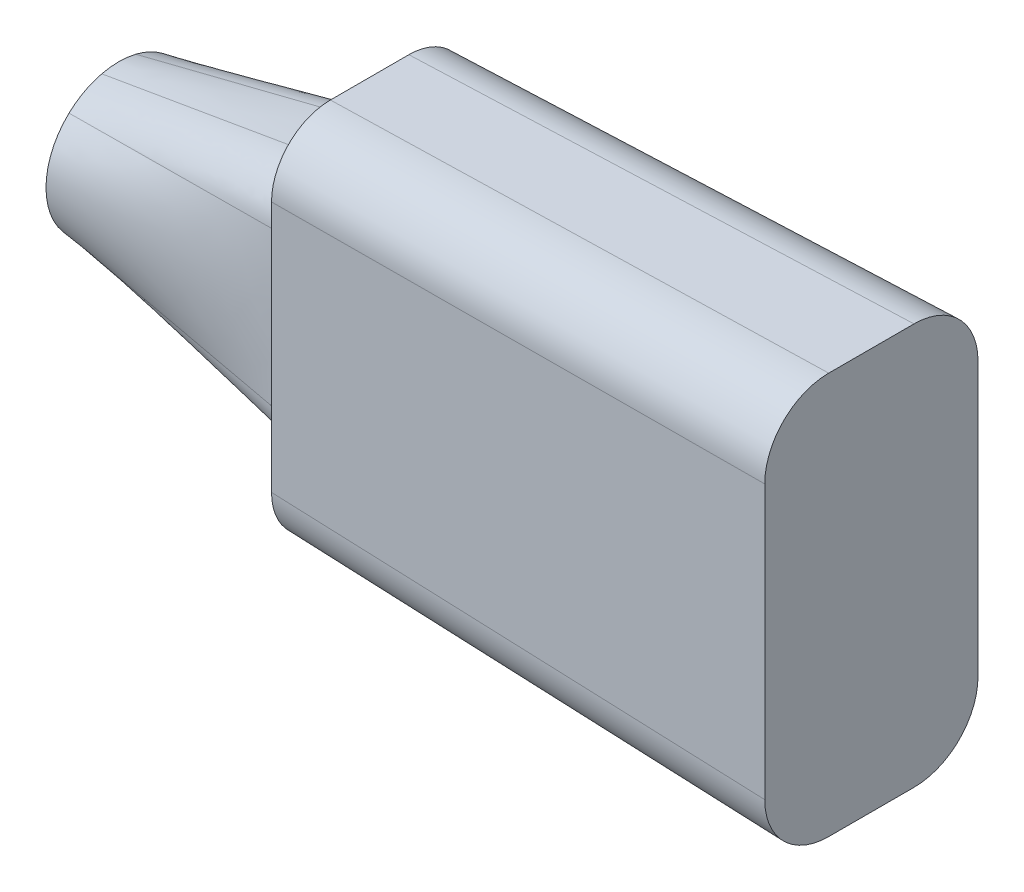
ISO-10303-21;
HEADER;
FILE_DESCRIPTION(('STEP AP214'),'2;1');
FILE_NAME('part.step','',(''),(''),'','','');
FILE_SCHEMA(('AUTOMOTIVE_DESIGN { 1 0 10303 214 1 1 1 1 }'));
ENDSEC;
DATA;
#1=APPLICATION_CONTEXT('core data for automotive mechanical design processes');
#2=APPLICATION_PROTOCOL_DEFINITION('international standard','automotive_design',2000,#1);
#3=PRODUCT_CONTEXT('',#1,'mechanical');
#4=PRODUCT('Part','Part','',(#3));
#5=PRODUCT_RELATED_PRODUCT_CATEGORY('part','',(#4));
#6=PRODUCT_DEFINITION_FORMATION('','',#4);
#7=PRODUCT_DEFINITION_CONTEXT('part definition',#1,'design');
#8=PRODUCT_DEFINITION('design','',#6,#7);
#9=PRODUCT_DEFINITION_SHAPE('','',#8);
#10=(LENGTH_UNIT() NAMED_UNIT(*) SI_UNIT(.MILLI.,.METRE.));
#11=(NAMED_UNIT(*) PLANE_ANGLE_UNIT() SI_UNIT($,.RADIAN.));
#12=(NAMED_UNIT(*) SI_UNIT($,.STERADIAN.) SOLID_ANGLE_UNIT());
#13=UNCERTAINTY_MEASURE_WITH_UNIT(LENGTH_MEASURE(1.E-05),#10,'distance_accuracy_value','');
#14=(GEOMETRIC_REPRESENTATION_CONTEXT(3) GLOBAL_UNCERTAINTY_ASSIGNED_CONTEXT((#13)) GLOBAL_UNIT_ASSIGNED_CONTEXT((#10,
#11,#12)) REPRESENTATION_CONTEXT('',''));
#15=CARTESIAN_POINT('',(0.,0.,0.));
#16=DIRECTION('',(0.,0.,1.));
#17=DIRECTION('',(1.,0.,0.));
#18=AXIS2_PLACEMENT_3D('',#15,#16,#17);
#19=CARTESIAN_POINT('',(-156.,32.,199.5));
#20=DIRECTION('',(-1.,0.,0.));
#21=DIRECTION('',(0.,0.,1.));
#22=AXIS2_PLACEMENT_3D('',#19,#20,#21);
#23=PLANE('',#22);
#24=CARTESIAN_POINT('',(-156.,32.,199.5));
#25=DIRECTION('',(-1.,0.,0.));
#26=DIRECTION('',(0.,-1.,0.));
#27=AXIS2_PLACEMENT_3D('',#24,#25,#26);
#28=CIRCLE('',#27,2.9);
#29=CARTESIAN_POINT('',(-156.,34.819974775106,200.1765665287));
#30=VERTEX_POINT('',#29);
#31=CARTESIAN_POINT('',(-156.,34.819974775106,198.82343347129));
#32=VERTEX_POINT('',#31);
#33=EDGE_CURVE('E10',#30,#32,#28,.T.);
#34=ORIENTED_EDGE('',*,*,#33,.T.);
#35=CARTESIAN_POINT('',(-156.,32.,199.5));
#36=DIRECTION('',(-1.,0.,0.));
#37=DIRECTION('',(0.,-1.,0.));
#38=AXIS2_PLACEMENT_3D('',#35,#36,#37);
#39=CIRCLE('',#38,2.9);
#40=CARTESIAN_POINT('',(-156.,34.116177449792,197.51712506673));
#41=VERTEX_POINT('',#40);
#42=EDGE_CURVE('E222',#32,#41,#39,.T.);
#43=ORIENTED_EDGE('',*,*,#42,.T.);
#44=CARTESIAN_POINT('',(-156.,32.,199.5));
#45=DIRECTION('',(-1.,0.,0.));
#46=DIRECTION('',(0.,-1.,0.));
#47=AXIS2_PLACEMENT_3D('',#44,#45,#46);
#48=CIRCLE('',#47,2.9);
#49=CARTESIAN_POINT('',(-156.,29.883822550208,197.51712506673));
#50=VERTEX_POINT('',#49);
#51=EDGE_CURVE('E320',#41,#50,#48,.T.);
#52=ORIENTED_EDGE('',*,*,#51,.T.);
#53=CARTESIAN_POINT('',(-156.,32.,199.5));
#54=DIRECTION('',(-1.,0.,0.));
#55=DIRECTION('',(0.,-1.,0.));
#56=AXIS2_PLACEMENT_3D('',#53,#54,#55);
#57=CIRCLE('',#56,2.9);
#58=CARTESIAN_POINT('',(-156.,29.180025224894,198.82343347129));
#59=VERTEX_POINT('',#58);
#60=EDGE_CURVE('E319',#50,#59,#57,.T.);
#61=ORIENTED_EDGE('',*,*,#60,.T.);
#62=CARTESIAN_POINT('',(-156.,32.,199.5));
#63=DIRECTION('',(-1.,0.,0.));
#64=DIRECTION('',(0.,-1.,0.));
#65=AXIS2_PLACEMENT_3D('',#62,#63,#64);
#66=CIRCLE('',#65,2.9);
#67=CARTESIAN_POINT('',(-156.,29.1,199.5));
#68=VERTEX_POINT('',#67);
#69=EDGE_CURVE('E376',#59,#68,#66,.T.);
#70=ORIENTED_EDGE('',*,*,#69,.T.);
#71=CARTESIAN_POINT('',(-156.,32.,199.5));
#72=DIRECTION('',(-1.,0.,0.));
#73=DIRECTION('',(0.,-1.,0.));
#74=AXIS2_PLACEMENT_3D('',#71,#72,#73);
#75=CIRCLE('',#74,2.9);
#76=CARTESIAN_POINT('',(-156.,29.180025224894,200.1765665287));
#77=VERTEX_POINT('',#76);
#78=EDGE_CURVE('E336',#68,#77,#75,.T.);
#79=ORIENTED_EDGE('',*,*,#78,.T.);
#80=CARTESIAN_POINT('',(-156.,32.,199.5));
#81=DIRECTION('',(-1.,0.,0.));
#82=DIRECTION('',(0.,-1.,0.));
#83=AXIS2_PLACEMENT_3D('',#80,#81,#82);
#84=CIRCLE('',#83,2.9);
#85=CARTESIAN_POINT('',(-156.,29.883822550208,201.48287493327));
#86=VERTEX_POINT('',#85);
#87=EDGE_CURVE('E292',#77,#86,#84,.T.);
#88=ORIENTED_EDGE('',*,*,#87,.T.);
#89=CARTESIAN_POINT('',(-156.,32.,199.5));
#90=DIRECTION('',(-1.,0.,0.));
#91=DIRECTION('',(0.,-1.,0.));
#92=AXIS2_PLACEMENT_3D('',#89,#90,#91);
#93=CIRCLE('',#92,2.9);
#94=CARTESIAN_POINT('',(-156.,34.116177449792,201.48287493327));
#95=VERTEX_POINT('',#94);
#96=EDGE_CURVE('E231',#86,#95,#93,.T.);
#97=ORIENTED_EDGE('',*,*,#96,.T.);
#98=CARTESIAN_POINT('',(-156.,32.,199.5));
#99=DIRECTION('',(-1.,0.,0.));
#100=DIRECTION('',(0.,-1.,0.));
#101=AXIS2_PLACEMENT_3D('',#98,#99,#100);
#102=CIRCLE('',#101,2.9);
#103=EDGE_CURVE('E28',#95,#30,#102,.T.);
#104=ORIENTED_EDGE('',*,*,#103,.T.);
#105=EDGE_LOOP('',(#34,#43,#52,#61,#70,#79,#88,#97,#104));
#106=FACE_BOUND('',#105,.T.);
#107=ADVANCED_FACE('F15',(#106),#23,.T.);
#108=CARTESIAN_POINT('',(-146.,36.96,200.69));
#109=CARTESIAN_POINT('',(-156.,34.819974775106,200.1765665287));
#110=CARTESIAN_POINT('',(-146.,36.96,200.214));
#111=CARTESIAN_POINT('',(-156.,34.883698878625,199.91096018126));
#112=CARTESIAN_POINT('',(-146.,36.96,199.738));
#113=CARTESIAN_POINT('',(-156.,34.916152983537,199.63785134543));
#114=CARTESIAN_POINT('',(-146.,36.96,199.262));
#115=CARTESIAN_POINT('',(-156.,34.916152983537,199.36214865456));
#116=CARTESIAN_POINT('',(-146.,36.96,198.786));
#117=CARTESIAN_POINT('',(-156.,34.883698878625,199.08903981873));
#118=CARTESIAN_POINT('',(-146.,36.96,198.31));
#119=CARTESIAN_POINT('',(-156.,34.819974775106,198.82343347129));
#120=(BOUNDED_SURFACE() B_SPLINE_SURFACE(5,1,((#108,#109),(#110,#111),(#112,#113),(#114,#115),
(#116,#117),(#118,#119)),.UNSPECIFIED.,.F.,.F.,.F.) B_SPLINE_SURFACE_WITH_KNOTS((6,6),(2,2),
(-1.19,1.19),(0.,1.),
.UNSPECIFIED.) GEOMETRIC_REPRESENTATION_ITEM() RATIONAL_B_SPLINE_SURFACE(((1.,1.),(1.,1.),(1.,
1.),(1.,1.),(1.,1.),(1.,1.))) REPRESENTATION_ITEM('') SURFACE());
#121=DIRECTION('',(0.,0.,1.));
#122=VECTOR('',#121,1.);
#123=CARTESIAN_POINT('',(-146.,36.96,199.5));
#124=LINE('',#123,#122);
#125=CARTESIAN_POINT('',(-146.,36.96,198.31));
#126=VERTEX_POINT('',#125);
#127=CARTESIAN_POINT('',(-146.,36.96,200.69));
#128=VERTEX_POINT('',#127);
#129=EDGE_CURVE('E215',#126,#128,#124,.T.);
#130=CARTESIAN_POINT('',(-146.,36.96,198.31));
#131=CARTESIAN_POINT('',(-156.,34.819974775106,198.82343347129));
#132=(BOUNDED_CURVE() B_SPLINE_CURVE(1,(#130,#131),.UNSPECIFIED.,.F.,
.F.) B_SPLINE_CURVE_WITH_KNOTS((2,2),(0.,1.),
.UNSPECIFIED.) CURVE() GEOMETRIC_REPRESENTATION_ITEM() RATIONAL_B_SPLINE_CURVE((1.,1.)) REPRESENTATION_ITEM(''));
#133=EDGE_CURVE('E216',#126,#32,#132,.T.);
#134=CARTESIAN_POINT('',(-146.,36.96,200.69));
#135=CARTESIAN_POINT('',(-156.,34.819974775106,200.1765665287));
#136=(BOUNDED_CURVE() B_SPLINE_CURVE(1,(#134,#135),.UNSPECIFIED.,.F.,
.F.) B_SPLINE_CURVE_WITH_KNOTS((2,2),(0.,1.),
.UNSPECIFIED.) CURVE() GEOMETRIC_REPRESENTATION_ITEM() RATIONAL_B_SPLINE_CURVE((1.,1.)) REPRESENTATION_ITEM(''));
#137=EDGE_CURVE('E223',#128,#30,#136,.T.);
#138=ORIENTED_EDGE('',*,*,#129,.F.);
#139=ORIENTED_EDGE('',*,*,#133,.T.);
#140=ORIENTED_EDGE('',*,*,#33,.F.);
#141=ORIENTED_EDGE('',*,*,#137,.F.);
#142=EDGE_LOOP('',(#138,#139,#140,#141));
#143=FACE_BOUND('',#142,.T.);
#144=ADVANCED_FACE('F495',(#143),#120,.T.);
#145=CARTESIAN_POINT('',(-146.,35.175,202.475));
#146=CARTESIAN_POINT('',(-156.,34.116177449792,201.48287493327));
#147=CARTESIAN_POINT('',(-146.,35.525483930416,202.475));
#148=CARTESIAN_POINT('',(-156.,34.244424984266,201.3460057158));
#149=CARTESIAN_POINT('',(-146.,35.875967971155,202.3963514917));
#150=CARTESIAN_POINT('',(-156.,34.362555516395,201.19965681357));
#151=CARTESIAN_POINT('',(-145.9999999999,36.205861123288,202.23905524758));
#152=CARTESIAN_POINT('',(-156.,34.469751592824,201.04470060556));
#153=CARTESIAN_POINT('',(-146.,36.494576879067,202.00957687906));
#154=CARTESIAN_POINT('',(-156.,34.565285920333,200.88209427657));
#155=CARTESIAN_POINT('',(-145.9999999999,36.72405524758,201.72086112328));
#156=CARTESIAN_POINT('',(-156.,34.648532564804,200.71286773568));
#157=CARTESIAN_POINT('',(-146.,36.881351491704,201.39096797115));
#158=CARTESIAN_POINT('',(-156.,34.718975727028,200.53811022912));
#159=CARTESIAN_POINT('',(-146.,36.96,201.04048393041));
#160=CARTESIAN_POINT('',(-156.,34.776216095344,200.35895564771));
#161=CARTESIAN_POINT('',(-146.,36.96,200.69));
#162=CARTESIAN_POINT('',(-156.,34.819974775106,200.1765665287));
#163=(BOUNDED_SURFACE() B_SPLINE_SURFACE(8,1,((#145,#146),(#147,#148),(#149,#150),(#151,#152),
(#153,#154),(#155,#156),(#157,#158),(#159,#160),(#161,#162)),.UNSPECIFIED.,.F.,.F.,
.F.) B_SPLINE_SURFACE_WITH_KNOTS((9,9),(2,2),(1.570796326795,3.14159265359),(0.,1.),
.UNSPECIFIED.) GEOMETRIC_REPRESENTATION_ITEM() RATIONAL_B_SPLINE_SURFACE(((1.,1.),(1.,1.),(1.,
1.),(1.,1.),(1.,1.),(1.,1.),(1.,1.),(1.,1.),(1.,1.))) REPRESENTATION_ITEM('') SURFACE());
#164=CARTESIAN_POINT('',(-146.,35.175,200.69));
#165=DIRECTION('',(-1.,0.,0.));
#166=DIRECTION('',(0.,-1.,0.));
#167=AXIS2_PLACEMENT_3D('',#164,#165,#166);
#168=CIRCLE('',#167,1.785);
#169=CARTESIAN_POINT('',(-146.,35.175,202.475));
#170=VERTEX_POINT('',#169);
#171=EDGE_CURVE('E264',#170,#128,#168,.T.);
#172=CARTESIAN_POINT('',(-146.,35.175,202.475));
#173=CARTESIAN_POINT('',(-156.,34.116177449792,201.48287493327));
#174=(BOUNDED_CURVE() B_SPLINE_CURVE(1,(#172,#173),.UNSPECIFIED.,.F.,
.F.) B_SPLINE_CURVE_WITH_KNOTS((2,2),(0.,1.),
.UNSPECIFIED.) CURVE() GEOMETRIC_REPRESENTATION_ITEM() RATIONAL_B_SPLINE_CURVE((1.,1.)) REPRESENTATION_ITEM(''));
#175=EDGE_CURVE('E283',#170,#95,#174,.T.);
#176=ORIENTED_EDGE('',*,*,#171,.T.);
#177=ORIENTED_EDGE('',*,*,#137,.T.);
#178=ORIENTED_EDGE('',*,*,#103,.F.);
#179=ORIENTED_EDGE('',*,*,#175,.F.);
#180=EDGE_LOOP('',(#176,#177,#178,#179));
#181=FACE_BOUND('',#180,.T.);
#182=ADVANCED_FACE('F493',(#181),#163,.T.);
#183=CARTESIAN_POINT('',(-146.,28.825,202.475));
#184=CARTESIAN_POINT('',(-156.,29.883822550208,201.48287493327));
#185=CARTESIAN_POINT('',(-146.,29.61875,202.475));
#186=CARTESIAN_POINT('',(-156.,30.289274387923,201.91558403738));
#187=CARTESIAN_POINT('',(-146.,30.4125,202.475));
#188=CARTESIAN_POINT('',(-156.,30.795845375594,202.25354404544));
#189=CARTESIAN_POINT('',(-146.,31.20625,202.475));
#190=CARTESIAN_POINT('',(-156.,31.377700771839,202.46918615549));
#191=CARTESIAN_POINT('',(-146.,32.,202.475));
#192=CARTESIAN_POINT('',(-155.9999999999,32.,202.54339413558));
#193=CARTESIAN_POINT('',(-146.,32.79375,202.475));
#194=CARTESIAN_POINT('',(-156.,32.622299228161,202.46918615549));
#195=CARTESIAN_POINT('',(-146.,33.5875,202.475));
#196=CARTESIAN_POINT('',(-155.9999999999,33.204154624406,202.25354404544));
#197=CARTESIAN_POINT('',(-146.,34.38125,202.475));
#198=CARTESIAN_POINT('',(-156.,33.710725612077,201.91558403738));
#199=CARTESIAN_POINT('',(-146.,35.175,202.475));
#200=CARTESIAN_POINT('',(-156.,34.116177449792,201.48287493327));
#201=(BOUNDED_SURFACE() B_SPLINE_SURFACE(8,1,((#183,#184),(#185,#186),(#187,#188),(#189,#190),
(#191,#192),(#193,#194),(#195,#196),(#197,#198),(#199,#200)),.UNSPECIFIED.,.F.,.F.,
.F.) B_SPLINE_SURFACE_WITH_KNOTS((9,9),(2,2),(-3.175,3.175),(0.,1.),
.UNSPECIFIED.) GEOMETRIC_REPRESENTATION_ITEM() RATIONAL_B_SPLINE_SURFACE(((1.,1.),(1.,1.),(1.,
1.),(1.,1.),(1.,1.),(1.,1.),(1.,1.),(1.,1.),(1.,1.))) REPRESENTATION_ITEM('') SURFACE());
#202=DIRECTION('',(0.,-1.,0.));
#203=VECTOR('',#202,1.);
#204=CARTESIAN_POINT('',(-146.,32.,202.475));
#205=LINE('',#204,#203);
#206=CARTESIAN_POINT('',(-146.,28.825,202.475));
#207=VERTEX_POINT('',#206);
#208=EDGE_CURVE('E210',#170,#207,#205,.T.);
#209=CARTESIAN_POINT('',(-146.,28.825,202.475));
#210=CARTESIAN_POINT('',(-156.,29.883822550208,201.48287493327));
#211=(BOUNDED_CURVE() B_SPLINE_CURVE(1,(#209,#210),.UNSPECIFIED.,.F.,
.F.) B_SPLINE_CURVE_WITH_KNOTS((2,2),(0.,1.),
.UNSPECIFIED.) CURVE() GEOMETRIC_REPRESENTATION_ITEM() RATIONAL_B_SPLINE_CURVE((1.,1.)) REPRESENTATION_ITEM(''));
#212=EDGE_CURVE('E330',#207,#86,#211,.T.);
#213=ORIENTED_EDGE('',*,*,#208,.F.);
#214=ORIENTED_EDGE('',*,*,#175,.T.);
#215=ORIENTED_EDGE('',*,*,#96,.F.);
#216=ORIENTED_EDGE('',*,*,#212,.F.);
#217=EDGE_LOOP('',(#213,#214,#215,#216));
#218=FACE_BOUND('',#217,.T.);
#219=ADVANCED_FACE('F491',(#218),#201,.T.);
#220=CARTESIAN_POINT('',(-146.,27.04,200.69));
#221=CARTESIAN_POINT('',(-156.,29.180025224894,200.1765665287));
#222=CARTESIAN_POINT('',(-146.,27.04,201.04048393041));
#223=CARTESIAN_POINT('',(-156.,29.223783904656,200.35895564771));
#224=CARTESIAN_POINT('',(-146.,27.118648508296,201.39096797115));
#225=CARTESIAN_POINT('',(-156.,29.281024272972,200.53811022912));
#226=CARTESIAN_POINT('',(-146.,27.27594475242,201.72086112328));
#227=CARTESIAN_POINT('',(-156.,29.351467435196,200.71286773568));
#228=CARTESIAN_POINT('',(-145.9999999999,27.505423120933,202.00957687906));
#229=CARTESIAN_POINT('',(-156.,29.434714079667,200.88209427657));
#230=CARTESIAN_POINT('',(-146.,27.794138876712,202.23905524758));
#231=CARTESIAN_POINT('',(-156.,29.530248407176,201.04470060556));
#232=CARTESIAN_POINT('',(-146.,28.124032028845,202.3963514917));
#233=CARTESIAN_POINT('',(-156.,29.637444483605,201.19965681357));
#234=CARTESIAN_POINT('',(-146.,28.474516069584,202.475));
#235=CARTESIAN_POINT('',(-156.,29.755575015734,201.3460057158));
#236=CARTESIAN_POINT('',(-146.,28.825,202.475));
#237=CARTESIAN_POINT('',(-156.,29.883822550208,201.48287493327));
#238=(BOUNDED_SURFACE() B_SPLINE_SURFACE(8,1,((#220,#221),(#222,#223),(#224,#225),(#226,#227),
(#228,#229),(#230,#231),(#232,#233),(#234,#235),(#236,#237)),.UNSPECIFIED.,.F.,.F.,
.F.) B_SPLINE_SURFACE_WITH_KNOTS((9,9),(2,2),(0.,1.570796326795),(0.,1.),
.UNSPECIFIED.) GEOMETRIC_REPRESENTATION_ITEM() RATIONAL_B_SPLINE_SURFACE(((1.,1.),(1.,1.),(1.,
1.),(1.,1.),(1.,1.),(1.,1.),(1.,1.),(1.,1.),(1.,1.))) REPRESENTATION_ITEM('') SURFACE());
#239=CARTESIAN_POINT('',(-146.,28.825,200.69));
#240=DIRECTION('',(-1.,0.,0.));
#241=DIRECTION('',(0.,-1.,0.));
#242=AXIS2_PLACEMENT_3D('',#239,#240,#241);
#243=CIRCLE('',#242,1.785);
#244=CARTESIAN_POINT('',(-146.,27.04,200.69));
#245=VERTEX_POINT('',#244);
#246=EDGE_CURVE('E207',#245,#207,#243,.T.);
#247=CARTESIAN_POINT('',(-146.,27.04,200.69));
#248=CARTESIAN_POINT('',(-156.,29.180025224894,200.1765665287));
#249=(BOUNDED_CURVE() B_SPLINE_CURVE(1,(#247,#248),.UNSPECIFIED.,.F.,
.F.) B_SPLINE_CURVE_WITH_KNOTS((2,2),(0.,1.),
.UNSPECIFIED.) CURVE() GEOMETRIC_REPRESENTATION_ITEM() RATIONAL_B_SPLINE_CURVE((1.,1.)) REPRESENTATION_ITEM(''));
#250=EDGE_CURVE('E125',#245,#77,#249,.T.);
#251=ORIENTED_EDGE('',*,*,#246,.T.);
#252=ORIENTED_EDGE('',*,*,#212,.T.);
#253=ORIENTED_EDGE('',*,*,#87,.F.);
#254=ORIENTED_EDGE('',*,*,#250,.F.);
#255=EDGE_LOOP('',(#251,#252,#253,#254));
#256=FACE_BOUND('',#255,.T.);
#257=ADVANCED_FACE('F489',(#256),#238,.T.);
#258=CARTESIAN_POINT('',(-146.,27.04,199.5));
#259=CARTESIAN_POINT('',(-156.,29.1,199.5));
#260=CARTESIAN_POINT('',(-146.,27.04,199.738));
#261=CARTESIAN_POINT('',(-156.,29.1,199.63657186127));
#262=CARTESIAN_POINT('',(-146.,27.04,199.976));
#263=CARTESIAN_POINT('',(-156.,29.108039585048,199.77314372416));
#264=CARTESIAN_POINT('',(-146.,27.04,200.214));
#265=CARTESIAN_POINT('',(-156.,29.12411885446,199.90908455413));
#266=CARTESIAN_POINT('',(-146.,27.04,200.452));
#267=CARTESIAN_POINT('',(-156.,29.148163173134,200.04376335498));
#268=CARTESIAN_POINT('',(-146.,27.04,200.69));
#269=CARTESIAN_POINT('',(-156.,29.180025224894,200.1765665287));
#270=(BOUNDED_SURFACE() B_SPLINE_SURFACE(5,1,((#258,#259),(#260,#261),(#262,#263),(#264,#265),
(#266,#267),(#268,#269)),.UNSPECIFIED.,.F.,.F.,.F.) B_SPLINE_SURFACE_WITH_KNOTS((6,6),(2,2),(0.,
1.19),(0.,1.),.UNSPECIFIED.) GEOMETRIC_REPRESENTATION_ITEM() RATIONAL_B_SPLINE_SURFACE(((1.,1.),
(1.,1.),(1.,1.),(1.,1.),(1.,1.),(1.,1.))) REPRESENTATION_ITEM('') SURFACE());
#271=DIRECTION('',(0.,0.,1.));
#272=VECTOR('',#271,1.);
#273=CARTESIAN_POINT('',(-146.,27.04,199.5));
#274=LINE('',#273,#272);
#275=CARTESIAN_POINT('',(-146.,27.04,199.5));
#276=VERTEX_POINT('',#275);
#277=EDGE_CURVE('E209',#276,#245,#274,.T.);
#278=CARTESIAN_POINT('',(-146.,27.04,199.5));
#279=CARTESIAN_POINT('',(-156.,29.1,199.5));
#280=(BOUNDED_CURVE() B_SPLINE_CURVE(1,(#278,#279),.UNSPECIFIED.,.F.,
.F.) B_SPLINE_CURVE_WITH_KNOTS((2,2),(0.,1.),
.UNSPECIFIED.) CURVE() GEOMETRIC_REPRESENTATION_ITEM() RATIONAL_B_SPLINE_CURVE((1.,1.)) REPRESENTATION_ITEM(''));
#281=EDGE_CURVE('E108',#276,#68,#280,.T.);
#282=ORIENTED_EDGE('',*,*,#277,.T.);
#283=ORIENTED_EDGE('',*,*,#250,.T.);
#284=ORIENTED_EDGE('',*,*,#78,.F.);
#285=ORIENTED_EDGE('',*,*,#281,.F.);
#286=EDGE_LOOP('',(#282,#283,#284,#285));
#287=FACE_BOUND('',#286,.T.);
#288=ADVANCED_FACE('F427',(#287),#270,.T.);
#289=CARTESIAN_POINT('',(-146.,27.04,198.31));
#290=CARTESIAN_POINT('',(-156.,29.180025224894,198.82343347129));
#291=CARTESIAN_POINT('',(-146.,27.04,198.548));
#292=CARTESIAN_POINT('',(-156.,29.148163173134,198.95623664501));
#293=CARTESIAN_POINT('',(-146.,27.04,198.786));
#294=CARTESIAN_POINT('',(-156.,29.12411885446,199.09091544586));
#295=CARTESIAN_POINT('',(-146.,27.04,199.024));
#296=CARTESIAN_POINT('',(-156.,29.108039585048,199.22685627583));
#297=CARTESIAN_POINT('',(-146.,27.04,199.262));
#298=CARTESIAN_POINT('',(-156.,29.1,199.36342813872));
#299=CARTESIAN_POINT('',(-146.,27.04,199.5));
#300=CARTESIAN_POINT('',(-156.,29.1,199.5));
#301=(BOUNDED_SURFACE() B_SPLINE_SURFACE(5,1,((#289,#290),(#291,#292),(#293,#294),(#295,#296),
(#297,#298),(#299,#300)),.UNSPECIFIED.,.F.,.F.,.F.) B_SPLINE_SURFACE_WITH_KNOTS((6,6),(2,2),
(-1.19,0.),(0.,1.),
.UNSPECIFIED.) GEOMETRIC_REPRESENTATION_ITEM() RATIONAL_B_SPLINE_SURFACE(((1.,1.),(1.,1.),(1.,
1.),(1.,1.),(1.,1.),(1.,1.))) REPRESENTATION_ITEM('') SURFACE());
#302=DIRECTION('',(0.,0.,1.));
#303=VECTOR('',#302,1.);
#304=CARTESIAN_POINT('',(-146.,27.04,199.5));
#305=LINE('',#304,#303);
#306=CARTESIAN_POINT('',(-146.,27.04,198.31));
#307=VERTEX_POINT('',#306);
#308=EDGE_CURVE('E312',#307,#276,#305,.T.);
#309=CARTESIAN_POINT('',(-146.,27.04,198.31));
#310=CARTESIAN_POINT('',(-156.,29.180025224894,198.82343347129));
#311=(BOUNDED_CURVE() B_SPLINE_CURVE(1,(#309,#310),.UNSPECIFIED.,.F.,
.F.) B_SPLINE_CURVE_WITH_KNOTS((2,2),(0.,1.),
.UNSPECIFIED.) CURVE() GEOMETRIC_REPRESENTATION_ITEM() RATIONAL_B_SPLINE_CURVE((1.,1.)) REPRESENTATION_ITEM(''));
#312=EDGE_CURVE('E313',#307,#59,#311,.T.);
#313=ORIENTED_EDGE('',*,*,#308,.T.);
#314=ORIENTED_EDGE('',*,*,#281,.T.);
#315=ORIENTED_EDGE('',*,*,#69,.F.);
#316=ORIENTED_EDGE('',*,*,#312,.F.);
#317=EDGE_LOOP('',(#313,#314,#315,#316));
#318=FACE_BOUND('',#317,.T.);
#319=ADVANCED_FACE('F17',(#318),#301,.T.);
#320=CARTESIAN_POINT('',(-146.,28.825,196.525));
#321=CARTESIAN_POINT('',(-156.,29.883822550208,197.51712506673));
#322=CARTESIAN_POINT('',(-146.,28.474516069584,196.525));
#323=CARTESIAN_POINT('',(-156.,29.755575015734,197.65399428419));
#324=CARTESIAN_POINT('',(-146.,28.124032028845,196.60364850829));
#325=CARTESIAN_POINT('',(-156.,29.637444483605,197.80034318642));
#326=CARTESIAN_POINT('',(-145.9999999999,27.794138876712,196.76094475242));
#327=CARTESIAN_POINT('',(-156.,29.530248407176,197.95529939443));
#328=CARTESIAN_POINT('',(-146.,27.505423120933,196.99042312093));
#329=CARTESIAN_POINT('',(-156.,29.434714079667,198.11790572342));
#330=CARTESIAN_POINT('',(-145.9999999999,27.27594475242,197.27913887671));
#331=CARTESIAN_POINT('',(-156.,29.351467435196,198.28713226431));
#332=CARTESIAN_POINT('',(-146.,27.118648508296,197.60903202884));
#333=CARTESIAN_POINT('',(-156.,29.281024272972,198.46188977087));
#334=CARTESIAN_POINT('',(-146.,27.04,197.95951606958));
#335=CARTESIAN_POINT('',(-156.,29.223783904656,198.64104435228));
#336=CARTESIAN_POINT('',(-146.,27.04,198.31));
#337=CARTESIAN_POINT('',(-156.,29.180025224894,198.82343347129));
#338=(BOUNDED_SURFACE() B_SPLINE_SURFACE(8,1,((#320,#321),(#322,#323),(#324,#325),(#326,#327),
(#328,#329),(#330,#331),(#332,#333),(#334,#335),(#336,#337)),.UNSPECIFIED.,.F.,.F.,
.F.) B_SPLINE_SURFACE_WITH_KNOTS((9,9),(2,2),(4.712388980385,6.28318530718),(0.,1.),
.UNSPECIFIED.) GEOMETRIC_REPRESENTATION_ITEM() RATIONAL_B_SPLINE_SURFACE(((1.,1.),(1.,1.),(1.,
1.),(1.,1.),(1.,1.),(1.,1.),(1.,1.),(1.,1.),(1.,1.))) REPRESENTATION_ITEM('') SURFACE());
#339=CARTESIAN_POINT('',(-146.,28.825,198.31));
#340=DIRECTION('',(-1.,0.,0.));
#341=DIRECTION('',(0.,-1.,0.));
#342=AXIS2_PLACEMENT_3D('',#339,#340,#341);
#343=CIRCLE('',#342,1.785);
#344=CARTESIAN_POINT('',(-146.,28.825,196.525));
#345=VERTEX_POINT('',#344);
#346=EDGE_CURVE('E263',#345,#307,#343,.T.);
#347=CARTESIAN_POINT('',(-146.,28.825,196.525));
#348=CARTESIAN_POINT('',(-156.,29.883822550208,197.51712506673));
#349=(BOUNDED_CURVE() B_SPLINE_CURVE(1,(#347,#348),.UNSPECIFIED.,.F.,
.F.) B_SPLINE_CURVE_WITH_KNOTS((2,2),(0.,1.),
.UNSPECIFIED.) CURVE() GEOMETRIC_REPRESENTATION_ITEM() RATIONAL_B_SPLINE_CURVE((1.,1.)) REPRESENTATION_ITEM(''));
#350=EDGE_CURVE('E221',#345,#50,#349,.T.);
#351=ORIENTED_EDGE('',*,*,#346,.T.);
#352=ORIENTED_EDGE('',*,*,#312,.T.);
#353=ORIENTED_EDGE('',*,*,#60,.F.);
#354=ORIENTED_EDGE('',*,*,#350,.F.);
#355=EDGE_LOOP('',(#351,#352,#353,#354));
#356=FACE_BOUND('',#355,.T.);
#357=ADVANCED_FACE('F481',(#356),#338,.T.);
#358=CARTESIAN_POINT('',(-146.,35.175,196.525));
#359=CARTESIAN_POINT('',(-156.,34.116177449792,197.51712506673));
#360=CARTESIAN_POINT('',(-146.,34.38125,196.525));
#361=CARTESIAN_POINT('',(-156.,33.710725612077,197.08441596261));
#362=CARTESIAN_POINT('',(-146.,33.5875,196.525));
#363=CARTESIAN_POINT('',(-156.,33.204154624406,196.74645595455));
#364=CARTESIAN_POINT('',(-146.,32.79375,196.525));
#365=CARTESIAN_POINT('',(-156.,32.622299228161,196.5308138445));
#366=CARTESIAN_POINT('',(-146.,32.,196.525));
#367=CARTESIAN_POINT('',(-156.,32.,196.45660586441));
#368=CARTESIAN_POINT('',(-146.,31.20625,196.525));
#369=CARTESIAN_POINT('',(-156.,31.377700771839,196.5308138445));
#370=CARTESIAN_POINT('',(-146.,30.4125,196.525));
#371=CARTESIAN_POINT('',(-156.,30.795845375594,196.74645595455));
#372=CARTESIAN_POINT('',(-146.,29.61875,196.525));
#373=CARTESIAN_POINT('',(-156.,30.289274387923,197.08441596261));
#374=CARTESIAN_POINT('',(-146.,28.825,196.525));
#375=CARTESIAN_POINT('',(-156.,29.883822550208,197.51712506673));
#376=(BOUNDED_SURFACE() B_SPLINE_SURFACE(8,1,((#358,#359),(#360,#361),(#362,#363),(#364,#365),
(#366,#367),(#368,#369),(#370,#371),(#372,#373),(#374,#375)),.UNSPECIFIED.,.F.,.F.,
.F.) B_SPLINE_SURFACE_WITH_KNOTS((9,9),(2,2),(-3.175,3.175),(0.,1.),
.UNSPECIFIED.) GEOMETRIC_REPRESENTATION_ITEM() RATIONAL_B_SPLINE_SURFACE(((1.,1.),(1.,1.),(1.,
1.),(1.,1.),(1.,1.),(1.,1.),(1.,1.),(1.,1.),(1.,1.))) REPRESENTATION_ITEM('') SURFACE());
#377=DIRECTION('',(0.,-1.,0.));
#378=VECTOR('',#377,1.);
#379=CARTESIAN_POINT('',(-146.,32.,196.525));
#380=LINE('',#379,#378);
#381=CARTESIAN_POINT('',(-146.,35.175,196.525));
#382=VERTEX_POINT('',#381);
#383=EDGE_CURVE('E258',#382,#345,#380,.T.);
#384=CARTESIAN_POINT('',(-146.,35.175,196.525));
#385=CARTESIAN_POINT('',(-156.,34.116177449792,197.51712506673));
#386=(BOUNDED_CURVE() B_SPLINE_CURVE(1,(#384,#385),.UNSPECIFIED.,.F.,
.F.) B_SPLINE_CURVE_WITH_KNOTS((2,2),(0.,1.),
.UNSPECIFIED.) CURVE() GEOMETRIC_REPRESENTATION_ITEM() RATIONAL_B_SPLINE_CURVE((1.,1.)) REPRESENTATION_ITEM(''));
#387=EDGE_CURVE('E299',#382,#41,#386,.T.);
#388=ORIENTED_EDGE('',*,*,#383,.T.);
#389=ORIENTED_EDGE('',*,*,#350,.T.);
#390=ORIENTED_EDGE('',*,*,#51,.F.);
#391=ORIENTED_EDGE('',*,*,#387,.F.);
#392=EDGE_LOOP('',(#388,#389,#390,#391));
#393=FACE_BOUND('',#392,.T.);
#394=ADVANCED_FACE('F502',(#393),#376,.T.);
#395=CARTESIAN_POINT('',(-146.,36.96,198.31));
#396=CARTESIAN_POINT('',(-156.,34.819974775106,198.82343347129));
#397=CARTESIAN_POINT('',(-146.,36.96,197.95951606958));
#398=CARTESIAN_POINT('',(-156.,34.776216095344,198.64104435228));
#399=CARTESIAN_POINT('',(-146.,36.881351491704,197.60903202884));
#400=CARTESIAN_POINT('',(-156.,34.718975727028,198.46188977087));
#401=CARTESIAN_POINT('',(-145.9999999999,36.72405524758,197.27913887671));
#402=CARTESIAN_POINT('',(-156.,34.648532564804,198.28713226431));
#403=CARTESIAN_POINT('',(-146.,36.494576879067,196.99042312093));
#404=CARTESIAN_POINT('',(-156.,34.565285920333,198.11790572342));
#405=CARTESIAN_POINT('',(-145.9999999999,36.205861123288,196.76094475242));
#406=CARTESIAN_POINT('',(-156.,34.469751592824,197.95529939443));
#407=CARTESIAN_POINT('',(-146.,35.875967971155,196.60364850829));
#408=CARTESIAN_POINT('',(-156.,34.362555516395,197.80034318642));
#409=CARTESIAN_POINT('',(-146.,35.525483930416,196.525));
#410=CARTESIAN_POINT('',(-156.,34.244424984266,197.65399428419));
#411=CARTESIAN_POINT('',(-146.,35.175,196.525));
#412=CARTESIAN_POINT('',(-156.,34.116177449792,197.51712506673));
#413=(BOUNDED_SURFACE() B_SPLINE_SURFACE(8,1,((#395,#396),(#397,#398),(#399,#400),(#401,#402),
(#403,#404),(#405,#406),(#407,#408),(#409,#410),(#411,#412)),.UNSPECIFIED.,.F.,.F.,
.F.) B_SPLINE_SURFACE_WITH_KNOTS((9,9),(2,2),(3.14159265359,4.712388980385),(0.,1.),
.UNSPECIFIED.) GEOMETRIC_REPRESENTATION_ITEM() RATIONAL_B_SPLINE_SURFACE(((1.,1.),(1.,1.),(1.,
1.),(1.,1.),(1.,1.),(1.,1.),(1.,1.),(1.,1.),(1.,1.))) REPRESENTATION_ITEM('') SURFACE());
#414=CARTESIAN_POINT('',(-146.,35.175,198.31));
#415=DIRECTION('',(-1.,0.,0.));
#416=DIRECTION('',(0.,-1.,0.));
#417=AXIS2_PLACEMENT_3D('',#414,#415,#416);
#418=CIRCLE('',#417,1.785);
#419=EDGE_CURVE('E205',#126,#382,#418,.T.);
#420=ORIENTED_EDGE('',*,*,#419,.T.);
#421=ORIENTED_EDGE('',*,*,#387,.T.);
#422=ORIENTED_EDGE('',*,*,#42,.F.);
#423=ORIENTED_EDGE('',*,*,#133,.F.);
#424=EDGE_LOOP('',(#420,#421,#422,#423));
#425=FACE_BOUND('',#424,.T.);
#426=ADVANCED_FACE('F498',(#425),#413,.T.);
#427=CARTESIAN_POINT('',(-126.,26.55,203.75));
#428=CARTESIAN_POINT('',(-146.,26.986,203.41));
#429=CARTESIAN_POINT('',(-126.,37.45,203.75));
#430=CARTESIAN_POINT('',(-146.,37.014,203.41));
#431=(BOUNDED_SURFACE() B_SPLINE_SURFACE(1,1,((#427,#428),(#429,#430)),.UNSPECIFIED.,.F.,.F.,
.F.) B_SPLINE_SURFACE_WITH_KNOTS((2,2),(2,2),(-5.45,5.45),(0.,1.),
.UNSPECIFIED.) GEOMETRIC_REPRESENTATION_ITEM() RATIONAL_B_SPLINE_SURFACE(((1.,1.),(1.,1.))) REPRESENTATION_ITEM('') SURFACE());
#432=DIRECTION('',(0.,-1.,0.));
#433=VECTOR('',#432,1.);
#434=CARTESIAN_POINT('',(-126.,32.,203.75));
#435=LINE('',#434,#433);
#436=CARTESIAN_POINT('',(-126.,37.45,203.75));
#437=VERTEX_POINT('',#436);
#438=CARTESIAN_POINT('',(-126.,26.55,203.75));
#439=VERTEX_POINT('',#438);
#440=EDGE_CURVE('E199',#437,#439,#435,.T.);
#441=CARTESIAN_POINT('',(-126.,37.45,203.75));
#442=CARTESIAN_POINT('',(-146.,37.014,203.41));
#443=(BOUNDED_CURVE() B_SPLINE_CURVE(1,(#441,#442),.UNSPECIFIED.,.F.,
.F.) B_SPLINE_CURVE_WITH_KNOTS((2,2),(0.,1.),
.UNSPECIFIED.) CURVE() GEOMETRIC_REPRESENTATION_ITEM() RATIONAL_B_SPLINE_CURVE((1.,1.)) REPRESENTATION_ITEM(''));
#444=CARTESIAN_POINT('',(-146.,37.014,203.41));
#445=VERTEX_POINT('',#444);
#446=EDGE_CURVE('E262',#437,#445,#443,.T.);
#447=DIRECTION('',(0.,-1.,0.));
#448=VECTOR('',#447,1.);
#449=CARTESIAN_POINT('',(-146.,32.,203.41));
#450=LINE('',#449,#448);
#451=CARTESIAN_POINT('',(-146.,26.986,203.41));
#452=VERTEX_POINT('',#451);
#453=EDGE_CURVE('E206',#445,#452,#450,.T.);
#454=CARTESIAN_POINT('',(-126.,26.55,203.75));
#455=CARTESIAN_POINT('',(-146.,26.986,203.41));
#456=(BOUNDED_CURVE() B_SPLINE_CURVE(1,(#454,#455),.UNSPECIFIED.,.F.,
.F.) B_SPLINE_CURVE_WITH_KNOTS((2,2),(0.,1.),
.UNSPECIFIED.) CURVE() GEOMETRIC_REPRESENTATION_ITEM() RATIONAL_B_SPLINE_CURVE((1.,1.)) REPRESENTATION_ITEM(''));
#457=EDGE_CURVE('E253',#439,#452,#456,.T.);
#458=ORIENTED_EDGE('',*,*,#440,.F.);
#459=ORIENTED_EDGE('',*,*,#446,.T.);
#460=ORIENTED_EDGE('',*,*,#453,.T.);
#461=ORIENTED_EDGE('',*,*,#457,.F.);
#462=EDGE_LOOP('',(#458,#459,#460,#461));
#463=FACE_BOUND('',#462,.T.);
#464=ADVANCED_FACE('F517',(#463),#431,.T.);
#465=CARTESIAN_POINT('',(-126.,24.,201.2));
#466=CARTESIAN_POINT('',(-146.,24.64,201.064));
#467=CARTESIAN_POINT('',(-126.,24.,201.70069132916));
#468=CARTESIAN_POINT('',(-146.,24.64,201.52463602283));
#469=CARTESIAN_POINT('',(-126.,24.112355011851,202.20138281593));
#470=CARTESIAN_POINT('',(-146.,24.743366610903,201.98527219066));
#471=CARTESIAN_POINT('',(-126.,24.337063932028,202.67265874755));
#472=CARTESIAN_POINT('',(-146.,24.950098817466,202.41884604775));
#473=CARTESIAN_POINT('',(-126.,24.664890172761,203.08510982723));
#474=CARTESIAN_POINT('',(-145.9999999999,25.25169895894,202.79830104106));
#475=CARTESIAN_POINT('',(-126.,25.077341252446,203.41293606797));
#476=CARTESIAN_POINT('',(-146.,25.63115395225,203.09990118253));
#477=CARTESIAN_POINT('',(-126.,25.548617184064,203.63764498814));
#478=CARTESIAN_POINT('',(-146.,26.064727809339,203.30663338909));
#479=CARTESIAN_POINT('',(-126.,26.049308670834,203.75));
#480=CARTESIAN_POINT('',(-146.,26.525363977167,203.41));
#481=CARTESIAN_POINT('',(-126.,26.55,203.75));
#482=CARTESIAN_POINT('',(-146.,26.986,203.41));
#483=(BOUNDED_SURFACE() B_SPLINE_SURFACE(8,1,((#465,#466),(#467,#468),(#469,#470),(#471,#472),
(#473,#474),(#475,#476),(#477,#478),(#479,#480),(#481,#482)),.UNSPECIFIED.,.F.,.F.,
.F.) B_SPLINE_SURFACE_WITH_KNOTS((9,9),(2,2),(3.14159265359,4.712388980385),(0.,1.),
.UNSPECIFIED.) GEOMETRIC_REPRESENTATION_ITEM() RATIONAL_B_SPLINE_SURFACE(((1.,1.),(1.,1.),(1.,
1.),(1.,1.),(1.,1.),(1.,1.),(1.,1.),(1.,1.),(1.,1.))) REPRESENTATION_ITEM('') SURFACE());
#484=CARTESIAN_POINT('',(-126.,26.55,201.2));
#485=DIRECTION('',(1.,0.,0.));
#486=DIRECTION('',(0.,1.,0.));
#487=AXIS2_PLACEMENT_3D('',#484,#485,#486);
#488=CIRCLE('',#487,2.55);
#489=CARTESIAN_POINT('',(-126.,24.,201.2));
#490=VERTEX_POINT('',#489);
#491=EDGE_CURVE('E249',#439,#490,#488,.T.);
#492=CARTESIAN_POINT('',(-146.,26.986,201.064));
#493=DIRECTION('',(-1.,0.,0.));
#494=DIRECTION('',(0.,-1.,0.));
#495=AXIS2_PLACEMENT_3D('',#492,#493,#494);
#496=CIRCLE('',#495,2.346);
#497=CARTESIAN_POINT('',(-146.,24.64,201.064));
#498=VERTEX_POINT('',#497);
#499=EDGE_CURVE('E21',#498,#452,#496,.T.);
#500=CARTESIAN_POINT('',(-126.,24.,201.2));
#501=CARTESIAN_POINT('',(-146.,24.64,201.064));
#502=(BOUNDED_CURVE() B_SPLINE_CURVE(1,(#500,#501),.UNSPECIFIED.,.F.,
.F.) B_SPLINE_CURVE_WITH_KNOTS((2,2),(0.,1.),
.UNSPECIFIED.) CURVE() GEOMETRIC_REPRESENTATION_ITEM() RATIONAL_B_SPLINE_CURVE((1.,1.)) REPRESENTATION_ITEM(''));
#503=EDGE_CURVE('E170',#490,#498,#502,.T.);
#504=ORIENTED_EDGE('',*,*,#491,.F.);
#505=ORIENTED_EDGE('',*,*,#457,.T.);
#506=ORIENTED_EDGE('',*,*,#499,.F.);
#507=ORIENTED_EDGE('',*,*,#503,.F.);
#508=EDGE_LOOP('',(#504,#505,#506,#507));
#509=FACE_BOUND('',#508,.T.);
#510=ADVANCED_FACE('F555',(#509),#483,.T.);
#511=CARTESIAN_POINT('',(-126.,24.,197.8));
#512=CARTESIAN_POINT('',(-146.,24.64,197.936));
#513=CARTESIAN_POINT('',(-126.,24.,201.2));
#514=CARTESIAN_POINT('',(-146.,24.64,201.064));
#515=(BOUNDED_SURFACE() B_SPLINE_SURFACE(1,1,((#511,#512),(#513,#514)),.UNSPECIFIED.,.F.,.F.,
.F.) B_SPLINE_SURFACE_WITH_KNOTS((2,2),(2,2),(-1.7,1.7),(0.,1.),
.UNSPECIFIED.) GEOMETRIC_REPRESENTATION_ITEM() RATIONAL_B_SPLINE_SURFACE(((1.,1.),(1.,1.))) REPRESENTATION_ITEM('') SURFACE());
#516=DIRECTION('',(0.,0.,1.));
#517=VECTOR('',#516,1.);
#518=CARTESIAN_POINT('',(-126.,24.,199.5));
#519=LINE('',#518,#517);
#520=CARTESIAN_POINT('',(-126.,24.,197.8));
#521=VERTEX_POINT('',#520);
#522=EDGE_CURVE('E243',#521,#490,#519,.T.);
#523=DIRECTION('',(0.,0.,1.));
#524=VECTOR('',#523,1.);
#525=CARTESIAN_POINT('',(-146.,24.64,199.5));
#526=LINE('',#525,#524);
#527=CARTESIAN_POINT('',(-146.,24.64,197.936));
#528=VERTEX_POINT('',#527);
#529=EDGE_CURVE('E173',#528,#498,#526,.T.);
#530=CARTESIAN_POINT('',(-126.,24.,197.8));
#531=CARTESIAN_POINT('',(-146.,24.64,197.936));
#532=(BOUNDED_CURVE() B_SPLINE_CURVE(1,(#530,#531),.UNSPECIFIED.,.F.,
.F.) B_SPLINE_CURVE_WITH_KNOTS((2,2),(0.,1.),
.UNSPECIFIED.) CURVE() GEOMETRIC_REPRESENTATION_ITEM() RATIONAL_B_SPLINE_CURVE((1.,1.)) REPRESENTATION_ITEM(''));
#533=EDGE_CURVE('E158',#521,#528,#532,.T.);
#534=ORIENTED_EDGE('',*,*,#522,.T.);
#535=ORIENTED_EDGE('',*,*,#503,.T.);
#536=ORIENTED_EDGE('',*,*,#529,.F.);
#537=ORIENTED_EDGE('',*,*,#533,.F.);
#538=EDGE_LOOP('',(#534,#535,#536,#537));
#539=FACE_BOUND('',#538,.T.);
#540=ADVANCED_FACE('F174',(#539),#515,.T.);
#541=CARTESIAN_POINT('',(-126.,26.55,195.25));
#542=CARTESIAN_POINT('',(-146.,26.986,195.59));
#543=CARTESIAN_POINT('',(-126.,26.049308670834,195.25));
#544=CARTESIAN_POINT('',(-146.,26.525363977167,195.59));
#545=CARTESIAN_POINT('',(-126.,25.548617184064,195.36235501185));
#546=CARTESIAN_POINT('',(-146.,26.064727809339,195.6933666109));
#547=CARTESIAN_POINT('',(-126.,25.077341252446,195.58706393202));
#548=CARTESIAN_POINT('',(-145.9999999999,25.631153952251,195.90009881746));
#549=CARTESIAN_POINT('',(-126.,24.664890172761,195.91489017276));
#550=CARTESIAN_POINT('',(-146.,25.25169895894,196.20169895894));
#551=CARTESIAN_POINT('',(-126.,24.337063932028,196.32734125244));
#552=CARTESIAN_POINT('',(-145.9999999999,24.950098817466,196.58115395225));
#553=CARTESIAN_POINT('',(-126.,24.112355011851,196.79861718406));
#554=CARTESIAN_POINT('',(-146.,24.743366610903,197.01472780933));
#555=CARTESIAN_POINT('',(-126.,24.,197.29930867083));
#556=CARTESIAN_POINT('',(-146.,24.64,197.47536397716));
#557=CARTESIAN_POINT('',(-126.,24.,197.8));
#558=CARTESIAN_POINT('',(-146.,24.64,197.936));
#559=(BOUNDED_SURFACE() B_SPLINE_SURFACE(8,1,((#541,#542),(#543,#544),(#545,#546),(#547,#548),
(#549,#550),(#551,#552),(#553,#554),(#555,#556),(#557,#558)),.UNSPECIFIED.,.F.,.F.,
.F.) B_SPLINE_SURFACE_WITH_KNOTS((9,9),(2,2),(1.570796326795,3.14159265359),(0.,1.),
.UNSPECIFIED.) GEOMETRIC_REPRESENTATION_ITEM() RATIONAL_B_SPLINE_SURFACE(((1.,1.),(1.,1.),(1.,
1.),(1.,1.),(1.,1.),(1.,1.),(1.,1.),(1.,1.),(1.,1.))) REPRESENTATION_ITEM('') SURFACE());
#560=CARTESIAN_POINT('',(-126.,26.55,197.8));
#561=DIRECTION('',(1.,0.,0.));
#562=DIRECTION('',(0.,1.,0.));
#563=AXIS2_PLACEMENT_3D('',#560,#561,#562);
#564=CIRCLE('',#563,2.55);
#565=CARTESIAN_POINT('',(-126.,26.55,195.25));
#566=VERTEX_POINT('',#565);
#567=EDGE_CURVE('E165',#521,#566,#564,.T.);
#568=CARTESIAN_POINT('',(-146.,26.986,197.936));
#569=DIRECTION('',(-1.,0.,0.));
#570=DIRECTION('',(0.,-1.,0.));
#571=AXIS2_PLACEMENT_3D('',#568,#569,#570);
#572=CIRCLE('',#571,2.346);
#573=CARTESIAN_POINT('',(-146.,26.986,195.59));
#574=VERTEX_POINT('',#573);
#575=EDGE_CURVE('E162',#574,#528,#572,.T.);
#576=CARTESIAN_POINT('',(-126.,26.55,195.25));
#577=CARTESIAN_POINT('',(-146.,26.986,195.59));
#578=(BOUNDED_CURVE() B_SPLINE_CURVE(1,(#576,#577),.UNSPECIFIED.,.F.,
.F.) B_SPLINE_CURVE_WITH_KNOTS((2,2),(0.,1.),
.UNSPECIFIED.) CURVE() GEOMETRIC_REPRESENTATION_ITEM() RATIONAL_B_SPLINE_CURVE((1.,1.)) REPRESENTATION_ITEM(''));
#579=EDGE_CURVE('E150',#566,#574,#578,.T.);
#580=ORIENTED_EDGE('',*,*,#567,.F.);
#581=ORIENTED_EDGE('',*,*,#533,.T.);
#582=ORIENTED_EDGE('',*,*,#575,.F.);
#583=ORIENTED_EDGE('',*,*,#579,.F.);
#584=EDGE_LOOP('',(#580,#581,#582,#583));
#585=FACE_BOUND('',#584,.T.);
#586=ADVANCED_FACE('F160',(#585),#559,.T.);
#587=CARTESIAN_POINT('',(-126.,37.45,195.25));
#588=CARTESIAN_POINT('',(-146.,37.014,195.59));
#589=CARTESIAN_POINT('',(-126.,26.55,195.25));
#590=CARTESIAN_POINT('',(-146.,26.986,195.59));
#591=(BOUNDED_SURFACE() B_SPLINE_SURFACE(1,1,((#587,#588),(#589,#590)),.UNSPECIFIED.,.F.,.F.,
.F.) B_SPLINE_SURFACE_WITH_KNOTS((2,2),(2,2),(-5.45,5.45),(0.,1.),
.UNSPECIFIED.) GEOMETRIC_REPRESENTATION_ITEM() RATIONAL_B_SPLINE_SURFACE(((1.,1.),(1.,1.))) REPRESENTATION_ITEM('') SURFACE());
#592=DIRECTION('',(0.,-1.,0.));
#593=VECTOR('',#592,1.);
#594=CARTESIAN_POINT('',(-126.,32.,195.25));
#595=LINE('',#594,#593);
#596=CARTESIAN_POINT('',(-126.,37.45,195.25));
#597=VERTEX_POINT('',#596);
#598=EDGE_CURVE('E232',#597,#566,#595,.T.);
#599=DIRECTION('',(0.,-1.,0.));
#600=VECTOR('',#599,1.);
#601=CARTESIAN_POINT('',(-146.,32.,195.59));
#602=LINE('',#601,#600);
#603=CARTESIAN_POINT('',(-146.,37.014,195.59));
#604=VERTEX_POINT('',#603);
#605=EDGE_CURVE('E184',#604,#574,#602,.T.);
#606=CARTESIAN_POINT('',(-126.,37.45,195.25));
#607=CARTESIAN_POINT('',(-146.,37.014,195.59));
#608=(BOUNDED_CURVE() B_SPLINE_CURVE(1,(#606,#607),.UNSPECIFIED.,.F.,
.F.) B_SPLINE_CURVE_WITH_KNOTS((2,2),(0.,1.),
.UNSPECIFIED.) CURVE() GEOMETRIC_REPRESENTATION_ITEM() RATIONAL_B_SPLINE_CURVE((1.,1.)) REPRESENTATION_ITEM(''));
#609=EDGE_CURVE('E240',#597,#604,#608,.T.);
#610=ORIENTED_EDGE('',*,*,#598,.T.);
#611=ORIENTED_EDGE('',*,*,#579,.T.);
#612=ORIENTED_EDGE('',*,*,#605,.F.);
#613=ORIENTED_EDGE('',*,*,#609,.F.);
#614=EDGE_LOOP('',(#610,#611,#612,#613));
#615=FACE_BOUND('',#614,.T.);
#616=ADVANCED_FACE('F565',(#615),#591,.T.);
#617=CARTESIAN_POINT('',(-126.,37.45,203.75));
#618=CARTESIAN_POINT('',(-146.,37.014,203.41));
#619=CARTESIAN_POINT('',(-126.,37.950691329166,203.75));
#620=CARTESIAN_POINT('',(-146.,37.474636022833,203.41));
#621=CARTESIAN_POINT('',(-126.,38.451382815936,203.63764498814));
#622=CARTESIAN_POINT('',(-146.,37.935272190661,203.30663338909));
#623=CARTESIAN_POINT('',(-126.,38.922658747554,203.41293606797));
#624=CARTESIAN_POINT('',(-145.9999999999,38.36884604775,203.09990118253));
#625=CARTESIAN_POINT('',(-126.,39.335109827239,203.08510982723));
#626=CARTESIAN_POINT('',(-146.,38.74830104106,202.79830104106));
#627=CARTESIAN_POINT('',(-126.,39.662936067972,202.67265874755));
#628=CARTESIAN_POINT('',(-145.9999999999,39.049901182534,202.41884604775));
#629=CARTESIAN_POINT('',(-126.,39.887644988149,202.20138281593));
#630=CARTESIAN_POINT('',(-146.,39.256633389097,201.98527219066));
#631=CARTESIAN_POINT('',(-126.,40.,201.70069132916));
#632=CARTESIAN_POINT('',(-146.,39.36,201.52463602283));
#633=CARTESIAN_POINT('',(-126.,40.,201.2));
#634=CARTESIAN_POINT('',(-146.,39.36,201.064));
#635=(BOUNDED_SURFACE() B_SPLINE_SURFACE(8,1,((#617,#618),(#619,#620),(#621,#622),(#623,#624),
(#625,#626),(#627,#628),(#629,#630),(#631,#632),(#633,#634)),.UNSPECIFIED.,.F.,.F.,
.F.) B_SPLINE_SURFACE_WITH_KNOTS((9,9),(2,2),(4.712388980385,6.28318530718),(0.,1.),
.UNSPECIFIED.) GEOMETRIC_REPRESENTATION_ITEM() RATIONAL_B_SPLINE_SURFACE(((1.,1.),(1.,1.),(1.,
1.),(1.,1.),(1.,1.),(1.,1.),(1.,1.),(1.,1.),(1.,1.))) REPRESENTATION_ITEM('') SURFACE());
#636=CARTESIAN_POINT('',(-126.,37.45,201.2));
#637=DIRECTION('',(1.,0.,0.));
#638=DIRECTION('',(0.,1.,0.));
#639=AXIS2_PLACEMENT_3D('',#636,#637,#638);
#640=CIRCLE('',#639,2.55);
#641=CARTESIAN_POINT('',(-126.,40.,201.2));
#642=VERTEX_POINT('',#641);
#643=EDGE_CURVE('E68',#642,#437,#640,.T.);
#644=CARTESIAN_POINT('',(-126.,40.,201.2));
#645=CARTESIAN_POINT('',(-146.,39.36,201.064));
#646=(BOUNDED_CURVE() B_SPLINE_CURVE(1,(#644,#645),.UNSPECIFIED.,.F.,
.F.) B_SPLINE_CURVE_WITH_KNOTS((2,2),(0.,1.),
.UNSPECIFIED.) CURVE() GEOMETRIC_REPRESENTATION_ITEM() RATIONAL_B_SPLINE_CURVE((1.,1.)) REPRESENTATION_ITEM(''));
#647=CARTESIAN_POINT('',(-146.,39.36,201.064));
#648=VERTEX_POINT('',#647);
#649=EDGE_CURVE('E200',#642,#648,#646,.T.);
#650=CARTESIAN_POINT('',(-146.,37.014,201.064));
#651=DIRECTION('',(-1.,0.,0.));
#652=DIRECTION('',(0.,-1.,0.));
#653=AXIS2_PLACEMENT_3D('',#650,#651,#652);
#654=CIRCLE('',#653,2.346);
#655=EDGE_CURVE('E201',#445,#648,#654,.T.);
#656=ORIENTED_EDGE('',*,*,#643,.F.);
#657=ORIENTED_EDGE('',*,*,#649,.T.);
#658=ORIENTED_EDGE('',*,*,#655,.F.);
#659=ORIENTED_EDGE('',*,*,#446,.F.);
#660=EDGE_LOOP('',(#656,#657,#658,#659));
#661=FACE_BOUND('',#660,.T.);
#662=ADVANCED_FACE('F556',(#661),#635,.T.);
#663=CARTESIAN_POINT('',(-146.,37.014,197.936));
#664=DIRECTION('',(-1.,0.,0.));
#665=DIRECTION('',(0.,0.,1.));
#666=AXIS2_PLACEMENT_3D('',#663,#664,#665);
#667=PLANE('',#666);
#668=ORIENTED_EDGE('',*,*,#419,.F.);
#669=ORIENTED_EDGE('',*,*,#129,.T.);
#670=ORIENTED_EDGE('',*,*,#171,.F.);
#671=ORIENTED_EDGE('',*,*,#208,.T.);
#672=ORIENTED_EDGE('',*,*,#246,.F.);
#673=ORIENTED_EDGE('',*,*,#277,.F.);
#674=ORIENTED_EDGE('',*,*,#308,.F.);
#675=ORIENTED_EDGE('',*,*,#346,.F.);
#676=ORIENTED_EDGE('',*,*,#383,.F.);
#677=EDGE_LOOP('',(#668,#669,#670,#671,#672,#673,#674,#675,#676));
#678=FACE_BOUND('',#677,.T.);
#679=DIRECTION('',(0.,0.,1.));
#680=VECTOR('',#679,1.);
#681=CARTESIAN_POINT('',(-146.,39.36,199.5));
#682=LINE('',#681,#680);
#683=CARTESIAN_POINT('',(-146.,39.36,197.936));
#684=VERTEX_POINT('',#683);
#685=EDGE_CURVE('E268',#684,#648,#682,.T.);
#686=ORIENTED_EDGE('',*,*,#685,.F.);
#687=CARTESIAN_POINT('',(-146.,37.014,197.936));
#688=DIRECTION('',(-1.,0.,0.));
#689=DIRECTION('',(0.,-1.,0.));
#690=AXIS2_PLACEMENT_3D('',#687,#688,#689);
#691=CIRCLE('',#690,2.346);
#692=EDGE_CURVE('E191',#684,#604,#691,.T.);
#693=ORIENTED_EDGE('',*,*,#692,.T.);
#694=ORIENTED_EDGE('',*,*,#605,.T.);
#695=ORIENTED_EDGE('',*,*,#575,.T.);
#696=ORIENTED_EDGE('',*,*,#529,.T.);
#697=ORIENTED_EDGE('',*,*,#499,.T.);
#698=ORIENTED_EDGE('',*,*,#453,.F.);
#699=ORIENTED_EDGE('',*,*,#655,.T.);
#700=EDGE_LOOP('',(#686,#693,#694,#695,#696,#697,#698,#699));
#701=FACE_BOUND('',#700,.T.);
#702=ADVANCED_FACE('F182',(#678,#701),#667,.T.);
#703=CARTESIAN_POINT('',(-126.,40.,197.8));
#704=CARTESIAN_POINT('',(-146.,39.36,197.936));
#705=CARTESIAN_POINT('',(-126.,40.,197.29930867083));
#706=CARTESIAN_POINT('',(-146.,39.36,197.47536397716));
#707=CARTESIAN_POINT('',(-126.,39.887644988149,196.79861718406));
#708=CARTESIAN_POINT('',(-146.,39.256633389097,197.01472780933));
#709=CARTESIAN_POINT('',(-126.,39.662936067972,196.32734125244));
#710=CARTESIAN_POINT('',(-145.9999999999,39.049901182534,196.58115395225));
#711=CARTESIAN_POINT('',(-126.,39.335109827239,195.91489017276));
#712=CARTESIAN_POINT('',(-146.,38.74830104106,196.20169895894));
#713=CARTESIAN_POINT('',(-126.,38.922658747554,195.58706393202));
#714=CARTESIAN_POINT('',(-145.9999999999,38.36884604775,195.90009881746));
#715=CARTESIAN_POINT('',(-126.,38.451382815936,195.36235501185));
#716=CARTESIAN_POINT('',(-146.,37.935272190661,195.6933666109));
#717=CARTESIAN_POINT('',(-126.,37.950691329166,195.25));
#718=CARTESIAN_POINT('',(-146.,37.474636022833,195.59));
#719=CARTESIAN_POINT('',(-126.,37.45,195.25));
#720=CARTESIAN_POINT('',(-146.,37.014,195.59));
#721=(BOUNDED_SURFACE() B_SPLINE_SURFACE(8,1,((#703,#704),(#705,#706),(#707,#708),(#709,#710),
(#711,#712),(#713,#714),(#715,#716),(#717,#718),(#719,#720)),.UNSPECIFIED.,.F.,.F.,
.F.) B_SPLINE_SURFACE_WITH_KNOTS((9,9),(2,2),(0.,1.570796326795),(0.,1.),
.UNSPECIFIED.) GEOMETRIC_REPRESENTATION_ITEM() RATIONAL_B_SPLINE_SURFACE(((1.,1.),(1.,1.),(1.,
1.),(1.,1.),(1.,1.),(1.,1.),(1.,1.),(1.,1.),(1.,1.))) REPRESENTATION_ITEM('') SURFACE());
#722=CARTESIAN_POINT('',(-126.,37.45,197.8));
#723=DIRECTION('',(1.,0.,0.));
#724=DIRECTION('',(0.,1.,0.));
#725=AXIS2_PLACEMENT_3D('',#722,#723,#724);
#726=CIRCLE('',#725,2.55);
#727=CARTESIAN_POINT('',(-126.,40.,197.8));
#728=VERTEX_POINT('',#727);
#729=EDGE_CURVE('E84',#597,#728,#726,.T.);
#730=CARTESIAN_POINT('',(-126.,40.,197.8));
#731=CARTESIAN_POINT('',(-146.,39.36,197.936));
#732=(BOUNDED_CURVE() B_SPLINE_CURVE(1,(#730,#731),.UNSPECIFIED.,.F.,
.F.) B_SPLINE_CURVE_WITH_KNOTS((2,2),(0.,1.),
.UNSPECIFIED.) CURVE() GEOMETRIC_REPRESENTATION_ITEM() RATIONAL_B_SPLINE_CURVE((1.,1.)) REPRESENTATION_ITEM(''));
#733=EDGE_CURVE('E272',#728,#684,#732,.T.);
#734=ORIENTED_EDGE('',*,*,#729,.F.);
#735=ORIENTED_EDGE('',*,*,#609,.T.);
#736=ORIENTED_EDGE('',*,*,#692,.F.);
#737=ORIENTED_EDGE('',*,*,#733,.F.);
#738=EDGE_LOOP('',(#734,#735,#736,#737));
#739=FACE_BOUND('',#738,.T.);
#740=ADVANCED_FACE('F699',(#739),#721,.T.);
#741=CARTESIAN_POINT('',(-126.,37.45,197.8));
#742=DIRECTION('',(1.,0.,0.));
#743=DIRECTION('',(0.,1.,0.));
#744=AXIS2_PLACEMENT_3D('',#741,#742,#743);
#745=PLANE('',#744);
#746=ORIENTED_EDGE('',*,*,#643,.T.);
#747=ORIENTED_EDGE('',*,*,#440,.T.);
#748=ORIENTED_EDGE('',*,*,#491,.T.);
#749=ORIENTED_EDGE('',*,*,#522,.F.);
#750=ORIENTED_EDGE('',*,*,#567,.T.);
#751=ORIENTED_EDGE('',*,*,#598,.F.);
#752=ORIENTED_EDGE('',*,*,#729,.T.);
#753=DIRECTION('',(0.,0.,1.));
#754=VECTOR('',#753,1.);
#755=CARTESIAN_POINT('',(-126.,40.,199.5));
#756=LINE('',#755,#754);
#757=EDGE_CURVE('E327',#728,#642,#756,.T.);
#758=ORIENTED_EDGE('',*,*,#757,.T.);
#759=EDGE_LOOP('',(#746,#747,#748,#749,#750,#751,#752,#758));
#760=FACE_BOUND('',#759,.T.);
#761=ADVANCED_FACE('F583',(#760),#745,.T.);
#762=CARTESIAN_POINT('',(-126.,40.,201.2));
#763=CARTESIAN_POINT('',(-146.,39.36,201.064));
#764=CARTESIAN_POINT('',(-126.,40.,197.8));
#765=CARTESIAN_POINT('',(-146.,39.36,197.936));
#766=(BOUNDED_SURFACE() B_SPLINE_SURFACE(1,1,((#762,#763),(#764,#765)),.UNSPECIFIED.,.F.,.F.,
.F.) B_SPLINE_SURFACE_WITH_KNOTS((2,2),(2,2),(-1.7,1.7),(0.,1.),
.UNSPECIFIED.) GEOMETRIC_REPRESENTATION_ITEM() RATIONAL_B_SPLINE_SURFACE(((1.,1.),(1.,1.))) REPRESENTATION_ITEM('') SURFACE());
#767=ORIENTED_EDGE('',*,*,#757,.F.);
#768=ORIENTED_EDGE('',*,*,#733,.T.);
#769=ORIENTED_EDGE('',*,*,#685,.T.);
#770=ORIENTED_EDGE('',*,*,#649,.F.);
#771=EDGE_LOOP('',(#767,#768,#769,#770));
#772=FACE_BOUND('',#771,.T.);
#773=ADVANCED_FACE('F586',(#772),#766,.T.);
#774=CLOSED_SHELL('',(#107,#144,#182,#219,#257,#288,#319,#357,#394,#426,#464,#510,#540,#586,
#616,#662,#702,#740,#761,#773));
#775=MANIFOLD_SOLID_BREP('B1',#774);
#776=ADVANCED_BREP_SHAPE_REPRESENTATION('',(#18,#775),#14);
#777=SHAPE_DEFINITION_REPRESENTATION(#9,#776);
ENDSEC;
END-ISO-10303-21;
